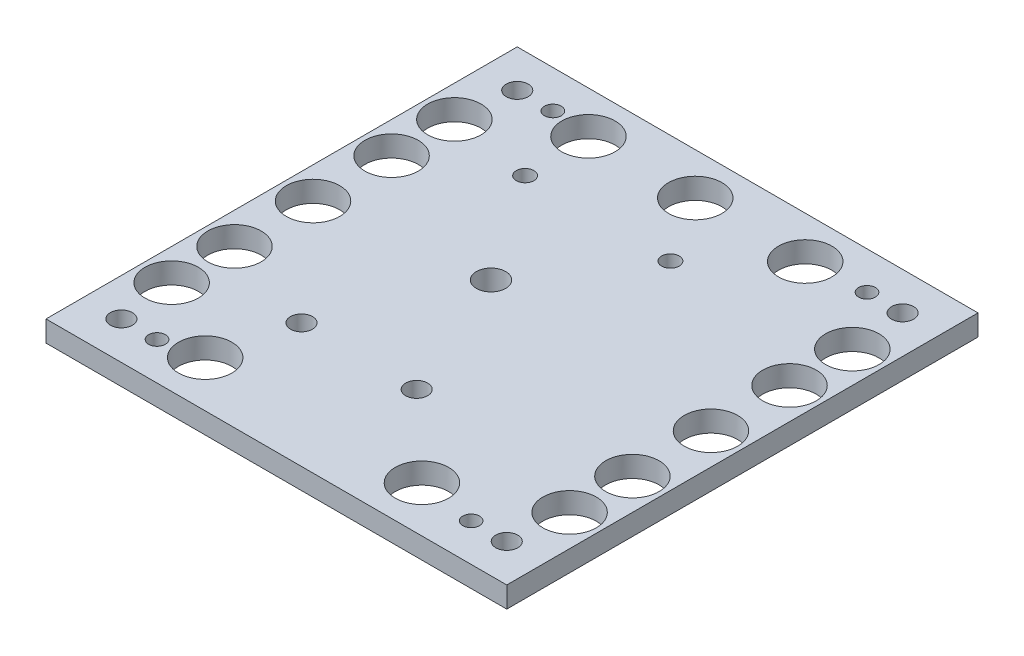
ISO-10303-21;
HEADER;
FILE_DESCRIPTION(('STEP AP214'),'2;1');
FILE_NAME('part.step','',(''),(''),'','','');
FILE_SCHEMA(('AUTOMOTIVE_DESIGN { 1 0 10303 214 1 1 1 1 }'));
ENDSEC;
DATA;
#1=APPLICATION_CONTEXT('core data for automotive mechanical design processes');
#2=APPLICATION_PROTOCOL_DEFINITION('international standard','automotive_design',2000,#1);
#3=PRODUCT_CONTEXT('',#1,'mechanical');
#4=PRODUCT('Part','Part','',(#3));
#5=PRODUCT_RELATED_PRODUCT_CATEGORY('part','',(#4));
#6=PRODUCT_DEFINITION_FORMATION('','',#4);
#7=PRODUCT_DEFINITION_CONTEXT('part definition',#1,'design');
#8=PRODUCT_DEFINITION('design','',#6,#7);
#9=PRODUCT_DEFINITION_SHAPE('','',#8);
#10=(LENGTH_UNIT() NAMED_UNIT(*) SI_UNIT(.MILLI.,.METRE.));
#11=(NAMED_UNIT(*) PLANE_ANGLE_UNIT() SI_UNIT($,.RADIAN.));
#12=(NAMED_UNIT(*) SI_UNIT($,.STERADIAN.) SOLID_ANGLE_UNIT());
#13=UNCERTAINTY_MEASURE_WITH_UNIT(LENGTH_MEASURE(1.E-05),#10,'distance_accuracy_value','');
#14=(GEOMETRIC_REPRESENTATION_CONTEXT(3) GLOBAL_UNCERTAINTY_ASSIGNED_CONTEXT((#13)) GLOBAL_UNIT_ASSIGNED_CONTEXT((#10,
#11,#12)) REPRESENTATION_CONTEXT('',''));
#15=CARTESIAN_POINT('',(0.,0.,0.));
#16=DIRECTION('',(0.,0.,1.));
#17=DIRECTION('',(1.,0.,0.));
#18=AXIS2_PLACEMENT_3D('',#15,#16,#17);
#19=CARTESIAN_POINT('',(110.,10.,112.5));
#20=DIRECTION('',(-1.,0.,0.));
#21=DIRECTION('',(0.,0.,1.));
#22=AXIS2_PLACEMENT_3D('',#19,#20,#21);
#23=PLANE('',#22);
#24=DIRECTION('',(0.,0.,-1.));
#25=VECTOR('',#24,1.);
#26=CARTESIAN_POINT('',(110.,0.,112.5));
#27=LINE('',#26,#25);
#28=CARTESIAN_POINT('',(110.,0.,112.5));
#29=VERTEX_POINT('',#28);
#30=CARTESIAN_POINT('',(110.,0.,-112.5));
#31=VERTEX_POINT('',#30);
#32=EDGE_CURVE('E102',#29,#31,#27,.T.);
#33=ORIENTED_EDGE('',*,*,#32,.T.);
#34=DIRECTION('',(0.,-1.,0.));
#35=VECTOR('',#34,1.);
#36=CARTESIAN_POINT('',(110.,10.,-112.5));
#37=LINE('',#36,#35);
#38=CARTESIAN_POINT('',(110.,10.,-112.5));
#39=VERTEX_POINT('',#38);
#40=EDGE_CURVE('E11',#39,#31,#37,.T.);
#41=ORIENTED_EDGE('',*,*,#40,.F.);
#42=DIRECTION('',(0.,0.,-1.));
#43=VECTOR('',#42,1.);
#44=CARTESIAN_POINT('',(110.,10.,112.5));
#45=LINE('',#44,#43);
#46=CARTESIAN_POINT('',(110.,10.,112.5));
#47=VERTEX_POINT('',#46);
#48=EDGE_CURVE('E90',#47,#39,#45,.T.);
#49=ORIENTED_EDGE('',*,*,#48,.F.);
#50=DIRECTION('',(0.,-1.,0.));
#51=VECTOR('',#50,1.);
#52=CARTESIAN_POINT('',(110.,10.,112.5));
#53=LINE('',#52,#51);
#54=EDGE_CURVE('E98',#47,#29,#53,.T.);
#55=ORIENTED_EDGE('',*,*,#54,.T.);
#56=EDGE_LOOP('',(#33,#41,#49,#55));
#57=FACE_BOUND('',#56,.T.);
#58=ADVANCED_FACE('F39',(#57),#23,.F.);
#59=CARTESIAN_POINT('',(-110.,10.,-112.5));
#60=DIRECTION('',(0.,0.,1.));
#61=DIRECTION('',(1.,0.,0.));
#62=AXIS2_PLACEMENT_3D('',#59,#60,#61);
#63=PLANE('',#62);
#64=DIRECTION('',(-1.,0.,0.));
#65=VECTOR('',#64,1.);
#66=CARTESIAN_POINT('',(-110.,0.,-112.5));
#67=LINE('',#66,#65);
#68=CARTESIAN_POINT('',(-110.,0.,-112.5));
#69=VERTEX_POINT('',#68);
#70=EDGE_CURVE('E94',#31,#69,#67,.T.);
#71=ORIENTED_EDGE('',*,*,#70,.T.);
#72=DIRECTION('',(0.,-1.,0.));
#73=VECTOR('',#72,1.);
#74=CARTESIAN_POINT('',(-110.,10.,-112.5));
#75=LINE('',#74,#73);
#76=CARTESIAN_POINT('',(-110.,10.,-112.5));
#77=VERTEX_POINT('',#76);
#78=EDGE_CURVE('E47',#77,#69,#75,.T.);
#79=ORIENTED_EDGE('',*,*,#78,.F.);
#80=DIRECTION('',(-1.,0.,0.));
#81=VECTOR('',#80,1.);
#82=CARTESIAN_POINT('',(-110.,10.,-112.5));
#83=LINE('',#82,#81);
#84=EDGE_CURVE('E85',#39,#77,#83,.T.);
#85=ORIENTED_EDGE('',*,*,#84,.F.);
#86=ORIENTED_EDGE('',*,*,#40,.T.);
#87=EDGE_LOOP('',(#71,#79,#85,#86));
#88=FACE_BOUND('',#87,.T.);
#89=ADVANCED_FACE('F93',(#88),#63,.F.);
#90=CARTESIAN_POINT('',(-110.,10.,112.5));
#91=DIRECTION('',(1.,0.,0.));
#92=DIRECTION('',(0.,0.,-1.));
#93=AXIS2_PLACEMENT_3D('',#90,#91,#92);
#94=PLANE('',#93);
#95=DIRECTION('',(0.,0.,1.));
#96=VECTOR('',#95,1.);
#97=CARTESIAN_POINT('',(-110.,0.,112.5));
#98=LINE('',#97,#96);
#99=CARTESIAN_POINT('',(-110.,0.,112.5));
#100=VERTEX_POINT('',#99);
#101=EDGE_CURVE('E72',#69,#100,#98,.T.);
#102=ORIENTED_EDGE('',*,*,#101,.T.);
#103=DIRECTION('',(0.,-1.,0.));
#104=VECTOR('',#103,1.);
#105=CARTESIAN_POINT('',(-110.,10.,112.5));
#106=LINE('',#105,#104);
#107=CARTESIAN_POINT('',(-110.,10.,112.5));
#108=VERTEX_POINT('',#107);
#109=EDGE_CURVE('E95',#108,#100,#106,.T.);
#110=ORIENTED_EDGE('',*,*,#109,.F.);
#111=DIRECTION('',(0.,0.,1.));
#112=VECTOR('',#111,1.);
#113=CARTESIAN_POINT('',(-110.,10.,112.5));
#114=LINE('',#113,#112);
#115=EDGE_CURVE('E88',#77,#108,#114,.T.);
#116=ORIENTED_EDGE('',*,*,#115,.F.);
#117=ORIENTED_EDGE('',*,*,#78,.T.);
#118=EDGE_LOOP('',(#102,#110,#116,#117));
#119=FACE_BOUND('',#118,.T.);
#120=ADVANCED_FACE('F96',(#119),#94,.F.);
#121=CARTESIAN_POINT('',(-110.,10.,112.5));
#122=DIRECTION('',(0.,0.,-1.));
#123=DIRECTION('',(-1.,0.,0.));
#124=AXIS2_PLACEMENT_3D('',#121,#122,#123);
#125=PLANE('',#124);
#126=DIRECTION('',(1.,0.,0.));
#127=VECTOR('',#126,1.);
#128=CARTESIAN_POINT('',(-110.,0.,112.5));
#129=LINE('',#128,#127);
#130=EDGE_CURVE('E78',#100,#29,#129,.T.);
#131=ORIENTED_EDGE('',*,*,#130,.T.);
#132=ORIENTED_EDGE('',*,*,#54,.F.);
#133=DIRECTION('',(1.,0.,0.));
#134=VECTOR('',#133,1.);
#135=CARTESIAN_POINT('',(-110.,10.,112.5));
#136=LINE('',#135,#134);
#137=EDGE_CURVE('E55',#108,#47,#136,.T.);
#138=ORIENTED_EDGE('',*,*,#137,.F.);
#139=ORIENTED_EDGE('',*,*,#109,.T.);
#140=EDGE_LOOP('',(#131,#132,#138,#139));
#141=FACE_BOUND('',#140,.T.);
#142=ADVANCED_FACE('F110',(#141),#125,.F.);
#143=CARTESIAN_POINT('',(0.,10.,0.));
#144=DIRECTION('',(0.,-1.,0.));
#145=DIRECTION('',(0.,0.,-1.));
#146=AXIS2_PLACEMENT_3D('',#143,#144,#145);
#147=PLANE('',#146);
#148=CARTESIAN_POINT('',(-94.9999999999998,10.,-37.4999999999994));
#149=DIRECTION('',(0.,1.,0.));
#150=DIRECTION('',(0.,0.,1.));
#151=AXIS2_PLACEMENT_3D('',#148,#149,#150);
#152=CIRCLE('',#151,12.75);
#153=CARTESIAN_POINT('',(-94.9999999999998,10.,-24.7499999999994));
#154=VERTEX_POINT('',#153);
#155=EDGE_CURVE('E224',#154,#154,#152,.T.);
#156=ORIENTED_EDGE('',*,*,#155,.F.);
#157=EDGE_LOOP('',(#156));
#158=FACE_BOUND('',#157,.T.);
#159=CARTESIAN_POINT('',(95.0000000000002,10.,5.38782117032671E-13));
#160=DIRECTION('',(0.,1.,0.));
#161=DIRECTION('',(0.,0.,1.));
#162=AXIS2_PLACEMENT_3D('',#159,#160,#161);
#163=CIRCLE('',#162,12.75);
#164=CARTESIAN_POINT('',(95.0000000000002,10.,12.7500000000005));
#165=VERTEX_POINT('',#164);
#166=EDGE_CURVE('E231',#165,#165,#163,.T.);
#167=ORIENTED_EDGE('',*,*,#166,.F.);
#168=EDGE_LOOP('',(#167));
#169=FACE_BOUND('',#168,.T.);
#170=CARTESIAN_POINT('',(95.0000000000002,10.,37.5000000000005));
#171=DIRECTION('',(0.,1.,0.));
#172=DIRECTION('',(0.,0.,1.));
#173=AXIS2_PLACEMENT_3D('',#170,#171,#172);
#174=CIRCLE('',#173,12.75);
#175=CARTESIAN_POINT('',(95.0000000000002,10.,50.2500000000005));
#176=VERTEX_POINT('',#175);
#177=EDGE_CURVE('E237',#176,#176,#174,.T.);
#178=ORIENTED_EDGE('',*,*,#177,.F.);
#179=EDGE_LOOP('',(#178));
#180=FACE_BOUND('',#179,.T.);
#181=CARTESIAN_POINT('',(95.0000000000002,10.,67.5000000000005));
#182=DIRECTION('',(0.,1.,0.));
#183=DIRECTION('',(0.,0.,1.));
#184=AXIS2_PLACEMENT_3D('',#181,#182,#183);
#185=CIRCLE('',#184,12.75);
#186=CARTESIAN_POINT('',(95.0000000000002,10.,80.2500000000005));
#187=VERTEX_POINT('',#186);
#188=EDGE_CURVE('E243',#187,#187,#185,.T.);
#189=ORIENTED_EDGE('',*,*,#188,.F.);
#190=EDGE_LOOP('',(#189));
#191=FACE_BOUND('',#190,.T.);
#192=CARTESIAN_POINT('',(47.5000000000002,10.,90.5000000000005));
#193=DIRECTION('',(0.,1.,0.));
#194=DIRECTION('',(0.,0.,1.));
#195=AXIS2_PLACEMENT_3D('',#192,#193,#194);
#196=CIRCLE('',#195,12.75);
#197=CARTESIAN_POINT('',(47.5000000000002,10.,103.250000000001));
#198=VERTEX_POINT('',#197);
#199=EDGE_CURVE('E200',#198,#198,#196,.T.);
#200=ORIENTED_EDGE('',*,*,#199,.F.);
#201=EDGE_LOOP('',(#200));
#202=FACE_BOUND('',#201,.T.);
#203=CARTESIAN_POINT('',(-55.9999999999998,10.,90.5000000000005));
#204=DIRECTION('',(0.,1.,0.));
#205=DIRECTION('',(0.,0.,1.));
#206=AXIS2_PLACEMENT_3D('',#203,#204,#205);
#207=CIRCLE('',#206,12.75);
#208=CARTESIAN_POINT('',(-55.9999999999998,10.,103.250000000001));
#209=VERTEX_POINT('',#208);
#210=EDGE_CURVE('E207',#209,#209,#207,.T.);
#211=ORIENTED_EDGE('',*,*,#210,.F.);
#212=EDGE_LOOP('',(#211));
#213=FACE_BOUND('',#212,.T.);
#214=CARTESIAN_POINT('',(-94.9999999999998,10.,67.5000000000005));
#215=DIRECTION('',(0.,1.,0.));
#216=DIRECTION('',(0.,0.,1.));
#217=AXIS2_PLACEMENT_3D('',#214,#215,#216);
#218=CIRCLE('',#217,12.75);
#219=CARTESIAN_POINT('',(-94.9999999999998,10.,80.2500000000005));
#220=VERTEX_POINT('',#219);
#221=EDGE_CURVE('E213',#220,#220,#218,.T.);
#222=ORIENTED_EDGE('',*,*,#221,.F.);
#223=EDGE_LOOP('',(#222));
#224=FACE_BOUND('',#223,.T.);
#225=CARTESIAN_POINT('',(-94.9999999999998,10.,37.5000000000006));
#226=DIRECTION('',(0.,1.,0.));
#227=DIRECTION('',(0.,0.,1.));
#228=AXIS2_PLACEMENT_3D('',#225,#226,#227);
#229=CIRCLE('',#228,12.75);
#230=CARTESIAN_POINT('',(-94.9999999999998,10.,50.2500000000005));
#231=VERTEX_POINT('',#230);
#232=EDGE_CURVE('E219',#231,#231,#229,.T.);
#233=ORIENTED_EDGE('',*,*,#232,.F.);
#234=EDGE_LOOP('',(#233));
#235=FACE_BOUND('',#234,.T.);
#236=CARTESIAN_POINT('',(-55.9999999999998,10.,-92.4999999999994));
#237=DIRECTION('',(0.,1.,0.));
#238=DIRECTION('',(0.,0.,1.));
#239=AXIS2_PLACEMENT_3D('',#236,#237,#238);
#240=CIRCLE('',#239,12.75);
#241=CARTESIAN_POINT('',(-55.9999999999998,10.,-79.7499999999994));
#242=VERTEX_POINT('',#241);
#243=EDGE_CURVE('E272',#242,#242,#240,.T.);
#244=ORIENTED_EDGE('',*,*,#243,.F.);
#245=EDGE_LOOP('',(#244));
#246=FACE_BOUND('',#245,.T.);
#247=CARTESIAN_POINT('',(-4.99999999999981,10.,-92.4999999999994));
#248=DIRECTION('',(0.,1.,0.));
#249=DIRECTION('',(0.,0.,1.));
#250=AXIS2_PLACEMENT_3D('',#247,#248,#249);
#251=CIRCLE('',#250,12.75);
#252=CARTESIAN_POINT('',(-4.99999999999981,10.,-79.7499999999994));
#253=VERTEX_POINT('',#252);
#254=EDGE_CURVE('E278',#253,#253,#251,.T.);
#255=ORIENTED_EDGE('',*,*,#254,.F.);
#256=EDGE_LOOP('',(#255));
#257=FACE_BOUND('',#256,.T.);
#258=CARTESIAN_POINT('',(-94.9999999999998,10.,-67.4999999999994));
#259=DIRECTION('',(0.,1.,0.));
#260=DIRECTION('',(0.,0.,1.));
#261=AXIS2_PLACEMENT_3D('',#258,#259,#260);
#262=CIRCLE('',#261,12.75);
#263=CARTESIAN_POINT('',(-94.9999999999998,10.,-54.7499999999995));
#264=VERTEX_POINT('',#263);
#265=EDGE_CURVE('E255',#264,#264,#262,.T.);
#266=ORIENTED_EDGE('',*,*,#265,.F.);
#267=EDGE_LOOP('',(#266));
#268=FACE_BOUND('',#267,.T.);
#269=CARTESIAN_POINT('',(95.0000000000002,10.,-37.4999999999995));
#270=DIRECTION('',(0.,1.,0.));
#271=DIRECTION('',(0.,0.,1.));
#272=AXIS2_PLACEMENT_3D('',#269,#270,#271);
#273=CIRCLE('',#272,12.75);
#274=CARTESIAN_POINT('',(95.0000000000002,10.,-24.7499999999995));
#275=VERTEX_POINT('',#274);
#276=EDGE_CURVE('E248',#275,#275,#273,.T.);
#277=ORIENTED_EDGE('',*,*,#276,.F.);
#278=EDGE_LOOP('',(#277));
#279=FACE_BOUND('',#278,.T.);
#280=CARTESIAN_POINT('',(95.0000000000002,10.,-67.4999999999995));
#281=DIRECTION('',(0.,1.,0.));
#282=DIRECTION('',(0.,0.,1.));
#283=AXIS2_PLACEMENT_3D('',#280,#281,#282);
#284=CIRCLE('',#283,12.75);
#285=CARTESIAN_POINT('',(95.0000000000002,10.,-54.7499999999995));
#286=VERTEX_POINT('',#285);
#287=EDGE_CURVE('E267',#286,#286,#284,.T.);
#288=ORIENTED_EDGE('',*,*,#287,.F.);
#289=EDGE_LOOP('',(#288));
#290=FACE_BOUND('',#289,.T.);
#291=CARTESIAN_POINT('',(47.5000000000002,10.,-92.4999999999994));
#292=DIRECTION('',(0.,1.,0.));
#293=DIRECTION('',(0.,0.,1.));
#294=AXIS2_PLACEMENT_3D('',#291,#292,#293);
#295=CIRCLE('',#294,12.75);
#296=CARTESIAN_POINT('',(47.5000000000002,10.,-79.7499999999994));
#297=VERTEX_POINT('',#296);
#298=EDGE_CURVE('E260',#297,#297,#295,.T.);
#299=ORIENTED_EDGE('',*,*,#298,.F.);
#300=EDGE_LOOP('',(#299));
#301=FACE_BOUND('',#300,.T.);
#302=CARTESIAN_POINT('',(-94.9999999999998,10.,5.62050406216471E-13));
#303=DIRECTION('',(0.,1.,0.));
#304=DIRECTION('',(0.,0.,1.));
#305=AXIS2_PLACEMENT_3D('',#302,#303,#304);
#306=CIRCLE('',#305,12.75);
#307=CARTESIAN_POINT('',(-94.9999999999998,10.,12.7500000000005));
#308=VERTEX_POINT('',#307);
#309=EDGE_CURVE('E193',#308,#308,#306,.T.);
#310=ORIENTED_EDGE('',*,*,#309,.F.);
#311=EDGE_LOOP('',(#310));
#312=FACE_BOUND('',#311,.T.);
#313=CARTESIAN_POINT('',(15.1299999999992,10.,-60.4999999999988));
#314=DIRECTION('',(0.,1.,0.));
#315=DIRECTION('',(0.,0.,1.));
#316=AXIS2_PLACEMENT_3D('',#313,#314,#315);
#317=CIRCLE('',#316,4.2);
#318=CARTESIAN_POINT('',(15.1299999999992,10.,-56.2999999999988));
#319=VERTEX_POINT('',#318);
#320=EDGE_CURVE('E190',#319,#319,#317,.T.);
#321=ORIENTED_EDGE('',*,*,#320,.F.);
#322=EDGE_LOOP('',(#321));
#323=FACE_BOUND('',#322,.T.);
#324=CARTESIAN_POINT('',(-54.8700000000008,10.,-61.1299999999993));
#325=DIRECTION('',(0.,1.,0.));
#326=DIRECTION('',(0.,0.,1.));
#327=AXIS2_PLACEMENT_3D('',#324,#325,#326);
#328=CIRCLE('',#327,4.2);
#329=CARTESIAN_POINT('',(-54.8700000000008,10.,-56.9299999999993));
#330=VERTEX_POINT('',#329);
#331=EDGE_CURVE('E184',#330,#330,#328,.T.);
#332=ORIENTED_EDGE('',*,*,#331,.F.);
#333=EDGE_LOOP('',(#332));
#334=FACE_BOUND('',#333,.T.);
#335=CARTESIAN_POINT('',(7.63000000000062,10.,53.1400000000011));
#336=DIRECTION('',(0.,1.,0.));
#337=DIRECTION('',(0.,0.,1.));
#338=AXIS2_PLACEMENT_3D('',#335,#336,#337);
#339=CIRCLE('',#338,5.24999999999999);
#340=CARTESIAN_POINT('',(7.63000000000062,10.,58.3900000000011));
#341=VERTEX_POINT('',#340);
#342=EDGE_CURVE('E178',#341,#341,#339,.T.);
#343=ORIENTED_EDGE('',*,*,#342,.F.);
#344=EDGE_LOOP('',(#343));
#345=FACE_BOUND('',#344,.T.);
#346=CARTESIAN_POINT('',(-47.3699999999994,10.,53.1400000000011));
#347=DIRECTION('',(0.,1.,0.));
#348=DIRECTION('',(0.,0.,1.));
#349=AXIS2_PLACEMENT_3D('',#346,#347,#348);
#350=CIRCLE('',#349,5.24999999999999);
#351=CARTESIAN_POINT('',(-47.3699999999994,10.,58.3900000000011));
#352=VERTEX_POINT('',#351);
#353=EDGE_CURVE('E172',#352,#352,#350,.T.);
#354=ORIENTED_EDGE('',*,*,#353,.F.);
#355=EDGE_LOOP('',(#354));
#356=FACE_BOUND('',#355,.T.);
#357=CARTESIAN_POINT('',(92.,10.,94.5));
#358=DIRECTION('',(0.,1.,0.));
#359=DIRECTION('',(0.,0.,1.));
#360=AXIS2_PLACEMENT_3D('',#357,#358,#359);
#361=CIRCLE('',#360,5.25);
#362=CARTESIAN_POINT('',(92.,10.,99.75));
#363=VERTEX_POINT('',#362);
#364=EDGE_CURVE('E166',#363,#363,#361,.T.);
#365=ORIENTED_EDGE('',*,*,#364,.F.);
#366=EDGE_LOOP('',(#365));
#367=FACE_BOUND('',#366,.T.);
#368=CARTESIAN_POINT('',(92.,10.,-94.5));
#369=DIRECTION('',(0.,1.,0.));
#370=DIRECTION('',(0.,0.,1.));
#371=AXIS2_PLACEMENT_3D('',#368,#369,#370);
#372=CIRCLE('',#371,5.25);
#373=CARTESIAN_POINT('',(92.,10.,-89.25));
#374=VERTEX_POINT('',#373);
#375=EDGE_CURVE('E160',#374,#374,#372,.T.);
#376=ORIENTED_EDGE('',*,*,#375,.F.);
#377=EDGE_LOOP('',(#376));
#378=FACE_BOUND('',#377,.T.);
#379=CARTESIAN_POINT('',(-92.,10.,-94.5));
#380=DIRECTION('',(0.,1.,0.));
#381=DIRECTION('',(0.,0.,1.));
#382=AXIS2_PLACEMENT_3D('',#379,#380,#381);
#383=CIRCLE('',#382,5.25);
#384=CARTESIAN_POINT('',(-92.,10.,-89.25));
#385=VERTEX_POINT('',#384);
#386=EDGE_CURVE('E154',#385,#385,#383,.T.);
#387=ORIENTED_EDGE('',*,*,#386,.F.);
#388=EDGE_LOOP('',(#387));
#389=FACE_BOUND('',#388,.T.);
#390=CARTESIAN_POINT('',(-92.,10.,94.5));
#391=DIRECTION('',(0.,1.,0.));
#392=DIRECTION('',(0.,0.,1.));
#393=AXIS2_PLACEMENT_3D('',#390,#391,#392);
#394=CIRCLE('',#393,5.25);
#395=CARTESIAN_POINT('',(-92.,10.,99.75));
#396=VERTEX_POINT('',#395);
#397=EDGE_CURVE('E148',#396,#396,#394,.T.);
#398=ORIENTED_EDGE('',*,*,#397,.F.);
#399=EDGE_LOOP('',(#398));
#400=FACE_BOUND('',#399,.T.);
#401=CARTESIAN_POINT('',(75.,10.,94.5));
#402=DIRECTION('',(0.,1.,0.));
#403=DIRECTION('',(0.,0.,1.));
#404=AXIS2_PLACEMENT_3D('',#401,#402,#403);
#405=CIRCLE('',#404,4.);
#406=CARTESIAN_POINT('',(75.,10.,98.5));
#407=VERTEX_POINT('',#406);
#408=EDGE_CURVE('E142',#407,#407,#405,.T.);
#409=ORIENTED_EDGE('',*,*,#408,.F.);
#410=EDGE_LOOP('',(#409));
#411=FACE_BOUND('',#410,.T.);
#412=CARTESIAN_POINT('',(-75.,10.,94.5));
#413=DIRECTION('',(0.,1.,0.));
#414=DIRECTION('',(0.,0.,1.));
#415=AXIS2_PLACEMENT_3D('',#412,#413,#414);
#416=CIRCLE('',#415,4.);
#417=CARTESIAN_POINT('',(-75.,10.,98.5));
#418=VERTEX_POINT('',#417);
#419=EDGE_CURVE('E136',#418,#418,#416,.T.);
#420=ORIENTED_EDGE('',*,*,#419,.F.);
#421=EDGE_LOOP('',(#420));
#422=FACE_BOUND('',#421,.T.);
#423=CARTESIAN_POINT('',(75.,10.,-94.5));
#424=DIRECTION('',(0.,1.,0.));
#425=DIRECTION('',(0.,0.,1.));
#426=AXIS2_PLACEMENT_3D('',#423,#424,#425);
#427=CIRCLE('',#426,4.);
#428=CARTESIAN_POINT('',(75.,10.,-90.5));
#429=VERTEX_POINT('',#428);
#430=EDGE_CURVE('E130',#429,#429,#427,.T.);
#431=ORIENTED_EDGE('',*,*,#430,.F.);
#432=EDGE_LOOP('',(#431));
#433=FACE_BOUND('',#432,.T.);
#434=CARTESIAN_POINT('',(-75.,10.,-94.5));
#435=DIRECTION('',(0.,1.,0.));
#436=DIRECTION('',(0.,0.,1.));
#437=AXIS2_PLACEMENT_3D('',#434,#435,#436);
#438=CIRCLE('',#437,4.);
#439=CARTESIAN_POINT('',(-75.,10.,-90.5));
#440=VERTEX_POINT('',#439);
#441=EDGE_CURVE('E124',#440,#440,#438,.T.);
#442=ORIENTED_EDGE('',*,*,#441,.F.);
#443=EDGE_LOOP('',(#442));
#444=FACE_BOUND('',#443,.T.);
#445=CARTESIAN_POINT('',(-19.8699999999994,10.,-9.85999999999988));
#446=DIRECTION('',(0.,-1.,0.));
#447=DIRECTION('',(0.,0.,-1.));
#448=AXIS2_PLACEMENT_3D('',#445,#446,#447);
#449=CIRCLE('',#448,7.);
#450=CARTESIAN_POINT('',(-19.8699999999994,10.,-16.8599999999999));
#451=VERTEX_POINT('',#450);
#452=EDGE_CURVE('E105',#451,#451,#449,.F.);
#453=ORIENTED_EDGE('',*,*,#452,.F.);
#454=EDGE_LOOP('',(#453));
#455=FACE_BOUND('',#454,.T.);
#456=ORIENTED_EDGE('',*,*,#48,.T.);
#457=ORIENTED_EDGE('',*,*,#84,.T.);
#458=ORIENTED_EDGE('',*,*,#115,.T.);
#459=ORIENTED_EDGE('',*,*,#137,.T.);
#460=EDGE_LOOP('',(#456,#457,#458,#459));
#461=FACE_BOUND('',#460,.T.);
#462=ADVANCED_FACE('F86',(#158,#169,#180,#191,#202,#213,#224,#235,#246,#257,#268,#279,#290,#301,
#312,#323,#334,#345,#356,#367,#378,#389,#400,#411,#422,#433,#444,#455,#461),#147,.F.);
#463=CARTESIAN_POINT('',(0.,0.,0.));
#464=DIRECTION('',(0.,-1.,0.));
#465=DIRECTION('',(0.,0.,-1.));
#466=AXIS2_PLACEMENT_3D('',#463,#464,#465);
#467=PLANE('',#466);
#468=CARTESIAN_POINT('',(-94.9999999999998,0.,-37.4999999999994));
#469=DIRECTION('',(0.,-1.,0.));
#470=DIRECTION('',(0.,0.,-1.));
#471=AXIS2_PLACEMENT_3D('',#468,#469,#470);
#472=CIRCLE('',#471,12.75);
#473=CARTESIAN_POINT('',(-94.9999999999998,0.,-50.2499999999994));
#474=VERTEX_POINT('',#473);
#475=EDGE_CURVE('E227',#474,#474,#472,.F.);
#476=ORIENTED_EDGE('',*,*,#475,.T.);
#477=EDGE_LOOP('',(#476));
#478=FACE_BOUND('',#477,.T.);
#479=CARTESIAN_POINT('',(95.0000000000002,0.,5.38782117032671E-13));
#480=DIRECTION('',(0.,-1.,0.));
#481=DIRECTION('',(0.,0.,-1.));
#482=AXIS2_PLACEMENT_3D('',#479,#480,#481);
#483=CIRCLE('',#482,12.75);
#484=CARTESIAN_POINT('',(95.0000000000002,0.,-12.7499999999995));
#485=VERTEX_POINT('',#484);
#486=EDGE_CURVE('E234',#485,#485,#483,.F.);
#487=ORIENTED_EDGE('',*,*,#486,.T.);
#488=EDGE_LOOP('',(#487));
#489=FACE_BOUND('',#488,.T.);
#490=CARTESIAN_POINT('',(95.0000000000002,0.,37.5000000000005));
#491=DIRECTION('',(0.,-1.,0.));
#492=DIRECTION('',(0.,0.,-1.));
#493=AXIS2_PLACEMENT_3D('',#490,#491,#492);
#494=CIRCLE('',#493,12.75);
#495=CARTESIAN_POINT('',(95.0000000000002,0.,24.7500000000005));
#496=VERTEX_POINT('',#495);
#497=EDGE_CURVE('E240',#496,#496,#494,.F.);
#498=ORIENTED_EDGE('',*,*,#497,.T.);
#499=EDGE_LOOP('',(#498));
#500=FACE_BOUND('',#499,.T.);
#501=CARTESIAN_POINT('',(95.0000000000002,0.,67.5000000000005));
#502=DIRECTION('',(0.,-1.,0.));
#503=DIRECTION('',(0.,0.,-1.));
#504=AXIS2_PLACEMENT_3D('',#501,#502,#503);
#505=CIRCLE('',#504,12.75);
#506=CARTESIAN_POINT('',(95.0000000000002,0.,54.7500000000005));
#507=VERTEX_POINT('',#506);
#508=EDGE_CURVE('E204',#507,#507,#505,.F.);
#509=ORIENTED_EDGE('',*,*,#508,.T.);
#510=EDGE_LOOP('',(#509));
#511=FACE_BOUND('',#510,.T.);
#512=CARTESIAN_POINT('',(47.5000000000002,0.,90.5000000000005));
#513=DIRECTION('',(0.,-1.,0.));
#514=DIRECTION('',(0.,0.,-1.));
#515=AXIS2_PLACEMENT_3D('',#512,#513,#514);
#516=CIRCLE('',#515,12.75);
#517=CARTESIAN_POINT('',(47.5000000000002,0.,77.7500000000005));
#518=VERTEX_POINT('',#517);
#519=EDGE_CURVE('E203',#518,#518,#516,.F.);
#520=ORIENTED_EDGE('',*,*,#519,.T.);
#521=EDGE_LOOP('',(#520));
#522=FACE_BOUND('',#521,.T.);
#523=CARTESIAN_POINT('',(-55.9999999999998,0.,90.5000000000005));
#524=DIRECTION('',(0.,-1.,0.));
#525=DIRECTION('',(0.,0.,-1.));
#526=AXIS2_PLACEMENT_3D('',#523,#524,#525);
#527=CIRCLE('',#526,12.75);
#528=CARTESIAN_POINT('',(-55.9999999999998,0.,77.7500000000005));
#529=VERTEX_POINT('',#528);
#530=EDGE_CURVE('E210',#529,#529,#527,.F.);
#531=ORIENTED_EDGE('',*,*,#530,.T.);
#532=EDGE_LOOP('',(#531));
#533=FACE_BOUND('',#532,.T.);
#534=CARTESIAN_POINT('',(-94.9999999999998,0.,67.5000000000005));
#535=DIRECTION('',(0.,-1.,0.));
#536=DIRECTION('',(0.,0.,-1.));
#537=AXIS2_PLACEMENT_3D('',#534,#535,#536);
#538=CIRCLE('',#537,12.75);
#539=CARTESIAN_POINT('',(-94.9999999999998,0.,54.7500000000006));
#540=VERTEX_POINT('',#539);
#541=EDGE_CURVE('E216',#540,#540,#538,.F.);
#542=ORIENTED_EDGE('',*,*,#541,.T.);
#543=EDGE_LOOP('',(#542));
#544=FACE_BOUND('',#543,.T.);
#545=CARTESIAN_POINT('',(-94.9999999999998,0.,37.5000000000006));
#546=DIRECTION('',(0.,-1.,0.));
#547=DIRECTION('',(0.,0.,-1.));
#548=AXIS2_PLACEMENT_3D('',#545,#546,#547);
#549=CIRCLE('',#548,12.75);
#550=CARTESIAN_POINT('',(-94.9999999999998,0.,24.7500000000006));
#551=VERTEX_POINT('',#550);
#552=EDGE_CURVE('E197',#551,#551,#549,.F.);
#553=ORIENTED_EDGE('',*,*,#552,.T.);
#554=EDGE_LOOP('',(#553));
#555=FACE_BOUND('',#554,.T.);
#556=CARTESIAN_POINT('',(-55.9999999999998,0.,-92.4999999999994));
#557=DIRECTION('',(0.,-1.,0.));
#558=DIRECTION('',(0.,0.,-1.));
#559=AXIS2_PLACEMENT_3D('',#556,#557,#558);
#560=CIRCLE('',#559,12.75);
#561=CARTESIAN_POINT('',(-55.9999999999998,0.,-105.249999999999));
#562=VERTEX_POINT('',#561);
#563=EDGE_CURVE('E275',#562,#562,#560,.F.);
#564=ORIENTED_EDGE('',*,*,#563,.T.);
#565=EDGE_LOOP('',(#564));
#566=FACE_BOUND('',#565,.T.);
#567=CARTESIAN_POINT('',(-4.99999999999981,0.,-92.4999999999994));
#568=DIRECTION('',(0.,-1.,0.));
#569=DIRECTION('',(0.,0.,-1.));
#570=AXIS2_PLACEMENT_3D('',#567,#568,#569);
#571=CIRCLE('',#570,12.75);
#572=CARTESIAN_POINT('',(-4.99999999999981,0.,-105.249999999999));
#573=VERTEX_POINT('',#572);
#574=EDGE_CURVE('E264',#573,#573,#571,.F.);
#575=ORIENTED_EDGE('',*,*,#574,.T.);
#576=EDGE_LOOP('',(#575));
#577=FACE_BOUND('',#576,.T.);
#578=CARTESIAN_POINT('',(-94.9999999999998,0.,-67.4999999999994));
#579=DIRECTION('',(0.,-1.,0.));
#580=DIRECTION('',(0.,0.,-1.));
#581=AXIS2_PLACEMENT_3D('',#578,#579,#580);
#582=CIRCLE('',#581,12.75);
#583=CARTESIAN_POINT('',(-94.9999999999998,0.,-80.2499999999994));
#584=VERTEX_POINT('',#583);
#585=EDGE_CURVE('E228',#584,#584,#582,.F.);
#586=ORIENTED_EDGE('',*,*,#585,.T.);
#587=EDGE_LOOP('',(#586));
#588=FACE_BOUND('',#587,.T.);
#589=CARTESIAN_POINT('',(95.0000000000002,0.,-37.4999999999995));
#590=DIRECTION('',(0.,-1.,0.));
#591=DIRECTION('',(0.,0.,-1.));
#592=AXIS2_PLACEMENT_3D('',#589,#590,#591);
#593=CIRCLE('',#592,12.75);
#594=CARTESIAN_POINT('',(95.0000000000002,0.,-50.2499999999994));
#595=VERTEX_POINT('',#594);
#596=EDGE_CURVE('E251',#595,#595,#593,.F.);
#597=ORIENTED_EDGE('',*,*,#596,.T.);
#598=EDGE_LOOP('',(#597));
#599=FACE_BOUND('',#598,.T.);
#600=CARTESIAN_POINT('',(95.0000000000002,0.,-67.4999999999995));
#601=DIRECTION('',(0.,-1.,0.));
#602=DIRECTION('',(0.,0.,-1.));
#603=AXIS2_PLACEMENT_3D('',#600,#601,#602);
#604=CIRCLE('',#603,12.75);
#605=CARTESIAN_POINT('',(95.0000000000002,0.,-80.2499999999995));
#606=VERTEX_POINT('',#605);
#607=EDGE_CURVE('E252',#606,#606,#604,.F.);
#608=ORIENTED_EDGE('',*,*,#607,.T.);
#609=EDGE_LOOP('',(#608));
#610=FACE_BOUND('',#609,.T.);
#611=CARTESIAN_POINT('',(47.5000000000002,0.,-92.4999999999994));
#612=DIRECTION('',(0.,-1.,0.));
#613=DIRECTION('',(0.,0.,-1.));
#614=AXIS2_PLACEMENT_3D('',#611,#612,#613);
#615=CIRCLE('',#614,12.75);
#616=CARTESIAN_POINT('',(47.5000000000002,0.,-105.249999999999));
#617=VERTEX_POINT('',#616);
#618=EDGE_CURVE('E263',#617,#617,#615,.F.);
#619=ORIENTED_EDGE('',*,*,#618,.T.);
#620=EDGE_LOOP('',(#619));
#621=FACE_BOUND('',#620,.T.);
#622=CARTESIAN_POINT('',(-94.9999999999998,0.,5.62050406216471E-13));
#623=DIRECTION('',(0.,-1.,0.));
#624=DIRECTION('',(0.,0.,-1.));
#625=AXIS2_PLACEMENT_3D('',#622,#623,#624);
#626=CIRCLE('',#625,12.75);
#627=CARTESIAN_POINT('',(-94.9999999999998,0.,-12.7499999999994));
#628=VERTEX_POINT('',#627);
#629=EDGE_CURVE('E194',#628,#628,#626,.F.);
#630=ORIENTED_EDGE('',*,*,#629,.T.);
#631=EDGE_LOOP('',(#630));
#632=FACE_BOUND('',#631,.T.);
#633=CARTESIAN_POINT('',(15.1299999999992,0.,-60.4999999999988));
#634=DIRECTION('',(0.,1.,0.));
#635=DIRECTION('',(0.,0.,1.));
#636=AXIS2_PLACEMENT_3D('',#633,#634,#635);
#637=CIRCLE('',#636,4.2);
#638=CARTESIAN_POINT('',(15.1299999999992,0.,-56.2999999999988));
#639=VERTEX_POINT('',#638);
#640=EDGE_CURVE('E187',#639,#639,#637,.T.);
#641=ORIENTED_EDGE('',*,*,#640,.T.);
#642=EDGE_LOOP('',(#641));
#643=FACE_BOUND('',#642,.T.);
#644=CARTESIAN_POINT('',(-54.8700000000008,0.,-61.1299999999993));
#645=DIRECTION('',(0.,1.,0.));
#646=DIRECTION('',(0.,0.,1.));
#647=AXIS2_PLACEMENT_3D('',#644,#645,#646);
#648=CIRCLE('',#647,4.2);
#649=CARTESIAN_POINT('',(-54.8700000000008,0.,-56.9299999999993));
#650=VERTEX_POINT('',#649);
#651=EDGE_CURVE('E181',#650,#650,#648,.T.);
#652=ORIENTED_EDGE('',*,*,#651,.T.);
#653=EDGE_LOOP('',(#652));
#654=FACE_BOUND('',#653,.T.);
#655=CARTESIAN_POINT('',(7.63000000000062,0.,53.1400000000011));
#656=DIRECTION('',(0.,1.,0.));
#657=DIRECTION('',(0.,0.,1.));
#658=AXIS2_PLACEMENT_3D('',#655,#656,#657);
#659=CIRCLE('',#658,5.25);
#660=CARTESIAN_POINT('',(7.63000000000062,0.,58.3900000000011));
#661=VERTEX_POINT('',#660);
#662=EDGE_CURVE('E175',#661,#661,#659,.T.);
#663=ORIENTED_EDGE('',*,*,#662,.T.);
#664=EDGE_LOOP('',(#663));
#665=FACE_BOUND('',#664,.T.);
#666=CARTESIAN_POINT('',(-47.3699999999994,0.,53.1400000000011));
#667=DIRECTION('',(0.,1.,0.));
#668=DIRECTION('',(0.,0.,1.));
#669=AXIS2_PLACEMENT_3D('',#666,#667,#668);
#670=CIRCLE('',#669,5.25);
#671=CARTESIAN_POINT('',(-47.3699999999994,0.,58.3900000000011));
#672=VERTEX_POINT('',#671);
#673=EDGE_CURVE('E169',#672,#672,#670,.T.);
#674=ORIENTED_EDGE('',*,*,#673,.T.);
#675=EDGE_LOOP('',(#674));
#676=FACE_BOUND('',#675,.T.);
#677=CARTESIAN_POINT('',(92.,0.,94.5));
#678=DIRECTION('',(0.,1.,0.));
#679=DIRECTION('',(0.,0.,1.));
#680=AXIS2_PLACEMENT_3D('',#677,#678,#679);
#681=CIRCLE('',#680,5.24999999999999);
#682=CARTESIAN_POINT('',(92.,0.,99.75));
#683=VERTEX_POINT('',#682);
#684=EDGE_CURVE('E163',#683,#683,#681,.T.);
#685=ORIENTED_EDGE('',*,*,#684,.T.);
#686=EDGE_LOOP('',(#685));
#687=FACE_BOUND('',#686,.T.);
#688=CARTESIAN_POINT('',(92.,0.,-94.5));
#689=DIRECTION('',(0.,1.,0.));
#690=DIRECTION('',(0.,0.,1.));
#691=AXIS2_PLACEMENT_3D('',#688,#689,#690);
#692=CIRCLE('',#691,5.25);
#693=CARTESIAN_POINT('',(92.,0.,-89.25));
#694=VERTEX_POINT('',#693);
#695=EDGE_CURVE('E157',#694,#694,#692,.T.);
#696=ORIENTED_EDGE('',*,*,#695,.T.);
#697=EDGE_LOOP('',(#696));
#698=FACE_BOUND('',#697,.T.);
#699=CARTESIAN_POINT('',(-92.,0.,-94.5));
#700=DIRECTION('',(0.,1.,0.));
#701=DIRECTION('',(0.,0.,1.));
#702=AXIS2_PLACEMENT_3D('',#699,#700,#701);
#703=CIRCLE('',#702,5.25);
#704=CARTESIAN_POINT('',(-92.,0.,-89.25));
#705=VERTEX_POINT('',#704);
#706=EDGE_CURVE('E151',#705,#705,#703,.T.);
#707=ORIENTED_EDGE('',*,*,#706,.T.);
#708=EDGE_LOOP('',(#707));
#709=FACE_BOUND('',#708,.T.);
#710=CARTESIAN_POINT('',(-92.,0.,94.5));
#711=DIRECTION('',(0.,1.,0.));
#712=DIRECTION('',(0.,0.,1.));
#713=AXIS2_PLACEMENT_3D('',#710,#711,#712);
#714=CIRCLE('',#713,5.25);
#715=CARTESIAN_POINT('',(-92.,0.,99.75));
#716=VERTEX_POINT('',#715);
#717=EDGE_CURVE('E145',#716,#716,#714,.T.);
#718=ORIENTED_EDGE('',*,*,#717,.T.);
#719=EDGE_LOOP('',(#718));
#720=FACE_BOUND('',#719,.T.);
#721=CARTESIAN_POINT('',(75.,0.,94.5));
#722=DIRECTION('',(0.,1.,0.));
#723=DIRECTION('',(0.,0.,1.));
#724=AXIS2_PLACEMENT_3D('',#721,#722,#723);
#725=CIRCLE('',#724,4.);
#726=CARTESIAN_POINT('',(75.,0.,98.5));
#727=VERTEX_POINT('',#726);
#728=EDGE_CURVE('E139',#727,#727,#725,.T.);
#729=ORIENTED_EDGE('',*,*,#728,.T.);
#730=EDGE_LOOP('',(#729));
#731=FACE_BOUND('',#730,.T.);
#732=CARTESIAN_POINT('',(-75.,0.,94.5));
#733=DIRECTION('',(0.,1.,0.));
#734=DIRECTION('',(0.,0.,1.));
#735=AXIS2_PLACEMENT_3D('',#732,#733,#734);
#736=CIRCLE('',#735,4.);
#737=CARTESIAN_POINT('',(-75.,0.,98.5));
#738=VERTEX_POINT('',#737);
#739=EDGE_CURVE('E133',#738,#738,#736,.T.);
#740=ORIENTED_EDGE('',*,*,#739,.T.);
#741=EDGE_LOOP('',(#740));
#742=FACE_BOUND('',#741,.T.);
#743=CARTESIAN_POINT('',(75.,0.,-94.5));
#744=DIRECTION('',(0.,1.,0.));
#745=DIRECTION('',(0.,0.,1.));
#746=AXIS2_PLACEMENT_3D('',#743,#744,#745);
#747=CIRCLE('',#746,4.);
#748=CARTESIAN_POINT('',(75.,0.,-90.5));
#749=VERTEX_POINT('',#748);
#750=EDGE_CURVE('E127',#749,#749,#747,.T.);
#751=ORIENTED_EDGE('',*,*,#750,.T.);
#752=EDGE_LOOP('',(#751));
#753=FACE_BOUND('',#752,.T.);
#754=CARTESIAN_POINT('',(-75.,0.,-94.5));
#755=DIRECTION('',(0.,1.,0.));
#756=DIRECTION('',(0.,0.,1.));
#757=AXIS2_PLACEMENT_3D('',#754,#755,#756);
#758=CIRCLE('',#757,4.);
#759=CARTESIAN_POINT('',(-75.,0.,-90.5));
#760=VERTEX_POINT('',#759);
#761=EDGE_CURVE('E121',#760,#760,#758,.T.);
#762=ORIENTED_EDGE('',*,*,#761,.T.);
#763=EDGE_LOOP('',(#762));
#764=FACE_BOUND('',#763,.T.);
#765=CARTESIAN_POINT('',(-19.8699999999994,0.,-9.85999999999988));
#766=DIRECTION('',(0.,-1.,0.));
#767=DIRECTION('',(0.,0.,-1.));
#768=AXIS2_PLACEMENT_3D('',#765,#766,#767);
#769=CIRCLE('',#768,7.);
#770=CARTESIAN_POINT('',(-19.8699999999994,0.,-16.8599999999999));
#771=VERTEX_POINT('',#770);
#772=EDGE_CURVE('E118',#771,#771,#769,.T.);
#773=ORIENTED_EDGE('',*,*,#772,.F.);
#774=EDGE_LOOP('',(#773));
#775=FACE_BOUND('',#774,.T.);
#776=ORIENTED_EDGE('',*,*,#32,.F.);
#777=ORIENTED_EDGE('',*,*,#130,.F.);
#778=ORIENTED_EDGE('',*,*,#101,.F.);
#779=ORIENTED_EDGE('',*,*,#70,.F.);
#780=EDGE_LOOP('',(#776,#777,#778,#779));
#781=FACE_BOUND('',#780,.T.);
#782=ADVANCED_FACE('F113',(#478,#489,#500,#511,#522,#533,#544,#555,#566,#577,#588,#599,#610,
#621,#632,#643,#654,#665,#676,#687,#698,#709,#720,#731,#742,#753,#764,#775,#781),#467,.T.);
#783=CARTESIAN_POINT('',(-19.8699999999994,10.001,-9.85999999999988));
#784=DIRECTION('',(0.,-1.,0.));
#785=DIRECTION('',(0.,0.,-1.));
#786=AXIS2_PLACEMENT_3D('',#783,#784,#785);
#787=CYLINDRICAL_SURFACE('',#786,7.);
#788=ORIENTED_EDGE('',*,*,#772,.T.);
#789=EDGE_LOOP('',(#788));
#790=FACE_BOUND('',#789,.T.);
#791=ORIENTED_EDGE('',*,*,#452,.T.);
#792=EDGE_LOOP('',(#791));
#793=FACE_BOUND('',#792,.T.);
#794=ADVANCED_FACE('F334',(#790,#793),#787,.F.);
#795=CARTESIAN_POINT('',(-75.,10.,-94.5));
#796=DIRECTION('',(0.,1.,0.));
#797=DIRECTION('',(0.,0.,1.));
#798=AXIS2_PLACEMENT_3D('',#795,#796,#797);
#799=CYLINDRICAL_SURFACE('',#798,4.);
#800=ORIENTED_EDGE('',*,*,#761,.F.);
#801=EDGE_LOOP('',(#800));
#802=FACE_BOUND('',#801,.T.);
#803=ORIENTED_EDGE('',*,*,#441,.T.);
#804=EDGE_LOOP('',(#803));
#805=FACE_BOUND('',#804,.T.);
#806=ADVANCED_FACE('F336',(#802,#805),#799,.F.);
#807=CARTESIAN_POINT('',(75.,10.,-94.5));
#808=DIRECTION('',(0.,1.,0.));
#809=DIRECTION('',(0.,0.,1.));
#810=AXIS2_PLACEMENT_3D('',#807,#808,#809);
#811=CYLINDRICAL_SURFACE('',#810,4.);
#812=ORIENTED_EDGE('',*,*,#750,.F.);
#813=EDGE_LOOP('',(#812));
#814=FACE_BOUND('',#813,.T.);
#815=ORIENTED_EDGE('',*,*,#430,.T.);
#816=EDGE_LOOP('',(#815));
#817=FACE_BOUND('',#816,.T.);
#818=ADVANCED_FACE('F343',(#814,#817),#811,.F.);
#819=CARTESIAN_POINT('',(-75.,10.,94.5));
#820=DIRECTION('',(0.,1.,0.));
#821=DIRECTION('',(0.,0.,1.));
#822=AXIS2_PLACEMENT_3D('',#819,#820,#821);
#823=CYLINDRICAL_SURFACE('',#822,4.);
#824=ORIENTED_EDGE('',*,*,#739,.F.);
#825=EDGE_LOOP('',(#824));
#826=FACE_BOUND('',#825,.T.);
#827=ORIENTED_EDGE('',*,*,#419,.T.);
#828=EDGE_LOOP('',(#827));
#829=FACE_BOUND('',#828,.T.);
#830=ADVANCED_FACE('F402',(#826,#829),#823,.F.);
#831=CARTESIAN_POINT('',(75.,10.,94.5));
#832=DIRECTION('',(0.,1.,0.));
#833=DIRECTION('',(0.,0.,1.));
#834=AXIS2_PLACEMENT_3D('',#831,#832,#833);
#835=CYLINDRICAL_SURFACE('',#834,4.);
#836=ORIENTED_EDGE('',*,*,#728,.F.);
#837=EDGE_LOOP('',(#836));
#838=FACE_BOUND('',#837,.T.);
#839=ORIENTED_EDGE('',*,*,#408,.T.);
#840=EDGE_LOOP('',(#839));
#841=FACE_BOUND('',#840,.T.);
#842=ADVANCED_FACE('F411',(#838,#841),#835,.F.);
#843=CARTESIAN_POINT('',(-92.,10.,94.5));
#844=DIRECTION('',(0.,1.,0.));
#845=DIRECTION('',(0.,0.,1.));
#846=AXIS2_PLACEMENT_3D('',#843,#844,#845);
#847=CYLINDRICAL_SURFACE('',#846,5.25);
#848=ORIENTED_EDGE('',*,*,#717,.F.);
#849=EDGE_LOOP('',(#848));
#850=FACE_BOUND('',#849,.T.);
#851=ORIENTED_EDGE('',*,*,#397,.T.);
#852=EDGE_LOOP('',(#851));
#853=FACE_BOUND('',#852,.T.);
#854=ADVANCED_FACE('F420',(#850,#853),#847,.F.);
#855=CARTESIAN_POINT('',(-92.,10.,-94.5));
#856=DIRECTION('',(0.,1.,0.));
#857=DIRECTION('',(0.,0.,1.));
#858=AXIS2_PLACEMENT_3D('',#855,#856,#857);
#859=CYLINDRICAL_SURFACE('',#858,5.25);
#860=ORIENTED_EDGE('',*,*,#706,.F.);
#861=EDGE_LOOP('',(#860));
#862=FACE_BOUND('',#861,.T.);
#863=ORIENTED_EDGE('',*,*,#386,.T.);
#864=EDGE_LOOP('',(#863));
#865=FACE_BOUND('',#864,.T.);
#866=ADVANCED_FACE('F429',(#862,#865),#859,.F.);
#867=CARTESIAN_POINT('',(92.,10.,-94.5));
#868=DIRECTION('',(0.,1.,0.));
#869=DIRECTION('',(0.,0.,1.));
#870=AXIS2_PLACEMENT_3D('',#867,#868,#869);
#871=CYLINDRICAL_SURFACE('',#870,5.25);
#872=ORIENTED_EDGE('',*,*,#695,.F.);
#873=EDGE_LOOP('',(#872));
#874=FACE_BOUND('',#873,.T.);
#875=ORIENTED_EDGE('',*,*,#375,.T.);
#876=EDGE_LOOP('',(#875));
#877=FACE_BOUND('',#876,.T.);
#878=ADVANCED_FACE('F438',(#874,#877),#871,.F.);
#879=CARTESIAN_POINT('',(92.,10.,94.5));
#880=DIRECTION('',(0.,1.,0.));
#881=DIRECTION('',(0.,0.,1.));
#882=AXIS2_PLACEMENT_3D('',#879,#880,#881);
#883=CYLINDRICAL_SURFACE('',#882,5.25);
#884=ORIENTED_EDGE('',*,*,#684,.F.);
#885=EDGE_LOOP('',(#884));
#886=FACE_BOUND('',#885,.T.);
#887=ORIENTED_EDGE('',*,*,#364,.T.);
#888=EDGE_LOOP('',(#887));
#889=FACE_BOUND('',#888,.T.);
#890=ADVANCED_FACE('F447',(#886,#889),#883,.F.);
#891=CARTESIAN_POINT('',(-47.3699999999994,10.,53.1400000000011));
#892=DIRECTION('',(0.,1.,0.));
#893=DIRECTION('',(0.,0.,1.));
#894=AXIS2_PLACEMENT_3D('',#891,#892,#893);
#895=CYLINDRICAL_SURFACE('',#894,5.24999999999999);
#896=ORIENTED_EDGE('',*,*,#673,.F.);
#897=EDGE_LOOP('',(#896));
#898=FACE_BOUND('',#897,.T.);
#899=ORIENTED_EDGE('',*,*,#353,.T.);
#900=EDGE_LOOP('',(#899));
#901=FACE_BOUND('',#900,.T.);
#902=ADVANCED_FACE('F456',(#898,#901),#895,.F.);
#903=CARTESIAN_POINT('',(7.63000000000062,10.,53.1400000000011));
#904=DIRECTION('',(0.,1.,0.));
#905=DIRECTION('',(0.,0.,1.));
#906=AXIS2_PLACEMENT_3D('',#903,#904,#905);
#907=CYLINDRICAL_SURFACE('',#906,5.24999999999999);
#908=ORIENTED_EDGE('',*,*,#662,.F.);
#909=EDGE_LOOP('',(#908));
#910=FACE_BOUND('',#909,.T.);
#911=ORIENTED_EDGE('',*,*,#342,.T.);
#912=EDGE_LOOP('',(#911));
#913=FACE_BOUND('',#912,.T.);
#914=ADVANCED_FACE('F465',(#910,#913),#907,.F.);
#915=CARTESIAN_POINT('',(-54.8700000000008,10.,-61.1299999999993));
#916=DIRECTION('',(0.,1.,0.));
#917=DIRECTION('',(0.,0.,1.));
#918=AXIS2_PLACEMENT_3D('',#915,#916,#917);
#919=CYLINDRICAL_SURFACE('',#918,4.2);
#920=ORIENTED_EDGE('',*,*,#651,.F.);
#921=EDGE_LOOP('',(#920));
#922=FACE_BOUND('',#921,.T.);
#923=ORIENTED_EDGE('',*,*,#331,.T.);
#924=EDGE_LOOP('',(#923));
#925=FACE_BOUND('',#924,.T.);
#926=ADVANCED_FACE('F474',(#922,#925),#919,.F.);
#927=CARTESIAN_POINT('',(15.1299999999992,10.,-60.4999999999988));
#928=DIRECTION('',(0.,1.,0.));
#929=DIRECTION('',(0.,0.,1.));
#930=AXIS2_PLACEMENT_3D('',#927,#928,#929);
#931=CYLINDRICAL_SURFACE('',#930,4.2);
#932=ORIENTED_EDGE('',*,*,#640,.F.);
#933=EDGE_LOOP('',(#932));
#934=FACE_BOUND('',#933,.T.);
#935=ORIENTED_EDGE('',*,*,#320,.T.);
#936=EDGE_LOOP('',(#935));
#937=FACE_BOUND('',#936,.T.);
#938=ADVANCED_FACE('F483',(#934,#937),#931,.F.);
#939=CARTESIAN_POINT('',(-94.9999999999998,-0.000999999999999265,5.62050406216471E-13));
#940=DIRECTION('',(0.,1.,0.));
#941=DIRECTION('',(0.,0.,1.));
#942=AXIS2_PLACEMENT_3D('',#939,#940,#941);
#943=CYLINDRICAL_SURFACE('',#942,12.75);
#944=ORIENTED_EDGE('',*,*,#629,.F.);
#945=EDGE_LOOP('',(#944));
#946=FACE_BOUND('',#945,.T.);
#947=ORIENTED_EDGE('',*,*,#309,.T.);
#948=EDGE_LOOP('',(#947));
#949=FACE_BOUND('',#948,.T.);
#950=ADVANCED_FACE('F492',(#946,#949),#943,.F.);
#951=CARTESIAN_POINT('',(47.5000000000002,-0.000999999999999265,-92.4999999999994));
#952=DIRECTION('',(0.,1.,0.));
#953=DIRECTION('',(0.,0.,1.));
#954=AXIS2_PLACEMENT_3D('',#951,#952,#953);
#955=CYLINDRICAL_SURFACE('',#954,12.75);
#956=ORIENTED_EDGE('',*,*,#618,.F.);
#957=EDGE_LOOP('',(#956));
#958=FACE_BOUND('',#957,.T.);
#959=ORIENTED_EDGE('',*,*,#298,.T.);
#960=EDGE_LOOP('',(#959));
#961=FACE_BOUND('',#960,.T.);
#962=ADVANCED_FACE('F501',(#958,#961),#955,.F.);
#963=CARTESIAN_POINT('',(95.0000000000002,-0.000999999999999265,-67.4999999999995));
#964=DIRECTION('',(0.,1.,0.));
#965=DIRECTION('',(0.,0.,1.));
#966=AXIS2_PLACEMENT_3D('',#963,#964,#965);
#967=CYLINDRICAL_SURFACE('',#966,12.75);
#968=ORIENTED_EDGE('',*,*,#607,.F.);
#969=EDGE_LOOP('',(#968));
#970=FACE_BOUND('',#969,.T.);
#971=ORIENTED_EDGE('',*,*,#287,.T.);
#972=EDGE_LOOP('',(#971));
#973=FACE_BOUND('',#972,.T.);
#974=ADVANCED_FACE('F510',(#970,#973),#967,.F.);
#975=CARTESIAN_POINT('',(95.0000000000002,-0.000999999999999265,-37.4999999999995));
#976=DIRECTION('',(0.,1.,0.));
#977=DIRECTION('',(0.,0.,1.));
#978=AXIS2_PLACEMENT_3D('',#975,#976,#977);
#979=CYLINDRICAL_SURFACE('',#978,12.75);
#980=ORIENTED_EDGE('',*,*,#596,.F.);
#981=EDGE_LOOP('',(#980));
#982=FACE_BOUND('',#981,.T.);
#983=ORIENTED_EDGE('',*,*,#276,.T.);
#984=EDGE_LOOP('',(#983));
#985=FACE_BOUND('',#984,.T.);
#986=ADVANCED_FACE('F519',(#982,#985),#979,.F.);
#987=CARTESIAN_POINT('',(-94.9999999999998,-0.000999999999999265,-67.4999999999994));
#988=DIRECTION('',(0.,1.,0.));
#989=DIRECTION('',(0.,0.,1.));
#990=AXIS2_PLACEMENT_3D('',#987,#988,#989);
#991=CYLINDRICAL_SURFACE('',#990,12.75);
#992=ORIENTED_EDGE('',*,*,#585,.F.);
#993=EDGE_LOOP('',(#992));
#994=FACE_BOUND('',#993,.T.);
#995=ORIENTED_EDGE('',*,*,#265,.T.);
#996=EDGE_LOOP('',(#995));
#997=FACE_BOUND('',#996,.T.);
#998=ADVANCED_FACE('F290',(#994,#997),#991,.F.);
#999=CARTESIAN_POINT('',(-4.99999999999981,-0.000999999999999265,-92.4999999999994));
#1000=DIRECTION('',(0.,1.,0.));
#1001=DIRECTION('',(0.,0.,1.));
#1002=AXIS2_PLACEMENT_3D('',#999,#1000,#1001);
#1003=CYLINDRICAL_SURFACE('',#1002,12.75);
#1004=ORIENTED_EDGE('',*,*,#574,.F.);
#1005=EDGE_LOOP('',(#1004));
#1006=FACE_BOUND('',#1005,.T.);
#1007=ORIENTED_EDGE('',*,*,#254,.T.);
#1008=EDGE_LOOP('',(#1007));
#1009=FACE_BOUND('',#1008,.T.);
#1010=ADVANCED_FACE('F286',(#1006,#1009),#1003,.F.);
#1011=CARTESIAN_POINT('',(-55.9999999999998,-0.000999999999999265,-92.4999999999994));
#1012=DIRECTION('',(0.,1.,0.));
#1013=DIRECTION('',(0.,0.,1.));
#1014=AXIS2_PLACEMENT_3D('',#1011,#1012,#1013);
#1015=CYLINDRICAL_SURFACE('',#1014,12.75);
#1016=ORIENTED_EDGE('',*,*,#563,.F.);
#1017=EDGE_LOOP('',(#1016));
#1018=FACE_BOUND('',#1017,.T.);
#1019=ORIENTED_EDGE('',*,*,#243,.T.);
#1020=EDGE_LOOP('',(#1019));
#1021=FACE_BOUND('',#1020,.T.);
#1022=ADVANCED_FACE('F289',(#1018,#1021),#1015,.F.);
#1023=CARTESIAN_POINT('',(-94.9999999999998,-0.000999999999999265,37.5000000000006));
#1024=DIRECTION('',(0.,1.,0.));
#1025=DIRECTION('',(0.,0.,1.));
#1026=AXIS2_PLACEMENT_3D('',#1023,#1024,#1025);
#1027=CYLINDRICAL_SURFACE('',#1026,12.75);
#1028=ORIENTED_EDGE('',*,*,#552,.F.);
#1029=EDGE_LOOP('',(#1028));
#1030=FACE_BOUND('',#1029,.T.);
#1031=ORIENTED_EDGE('',*,*,#232,.T.);
#1032=EDGE_LOOP('',(#1031));
#1033=FACE_BOUND('',#1032,.T.);
#1034=ADVANCED_FACE('F549',(#1030,#1033),#1027,.F.);
#1035=CARTESIAN_POINT('',(-94.9999999999998,-0.000999999999999265,67.5000000000005));
#1036=DIRECTION('',(0.,1.,0.));
#1037=DIRECTION('',(0.,0.,1.));
#1038=AXIS2_PLACEMENT_3D('',#1035,#1036,#1037);
#1039=CYLINDRICAL_SURFACE('',#1038,12.75);
#1040=ORIENTED_EDGE('',*,*,#541,.F.);
#1041=EDGE_LOOP('',(#1040));
#1042=FACE_BOUND('',#1041,.T.);
#1043=ORIENTED_EDGE('',*,*,#221,.T.);
#1044=EDGE_LOOP('',(#1043));
#1045=FACE_BOUND('',#1044,.T.);
#1046=ADVANCED_FACE('F558',(#1042,#1045),#1039,.F.);
#1047=CARTESIAN_POINT('',(-55.9999999999998,-0.000999999999999265,90.5000000000005));
#1048=DIRECTION('',(0.,1.,0.));
#1049=DIRECTION('',(0.,0.,1.));
#1050=AXIS2_PLACEMENT_3D('',#1047,#1048,#1049);
#1051=CYLINDRICAL_SURFACE('',#1050,12.75);
#1052=ORIENTED_EDGE('',*,*,#530,.F.);
#1053=EDGE_LOOP('',(#1052));
#1054=FACE_BOUND('',#1053,.T.);
#1055=ORIENTED_EDGE('',*,*,#210,.T.);
#1056=EDGE_LOOP('',(#1055));
#1057=FACE_BOUND('',#1056,.T.);
#1058=ADVANCED_FACE('F567',(#1054,#1057),#1051,.F.);
#1059=CARTESIAN_POINT('',(47.5000000000002,-0.000999999999999265,90.5000000000005));
#1060=DIRECTION('',(0.,1.,0.));
#1061=DIRECTION('',(0.,0.,1.));
#1062=AXIS2_PLACEMENT_3D('',#1059,#1060,#1061);
#1063=CYLINDRICAL_SURFACE('',#1062,12.75);
#1064=ORIENTED_EDGE('',*,*,#519,.F.);
#1065=EDGE_LOOP('',(#1064));
#1066=FACE_BOUND('',#1065,.T.);
#1067=ORIENTED_EDGE('',*,*,#199,.T.);
#1068=EDGE_LOOP('',(#1067));
#1069=FACE_BOUND('',#1068,.T.);
#1070=ADVANCED_FACE('F576',(#1066,#1069),#1063,.F.);
#1071=CARTESIAN_POINT('',(95.0000000000002,-0.000999999999999265,67.5000000000005));
#1072=DIRECTION('',(0.,1.,0.));
#1073=DIRECTION('',(0.,0.,1.));
#1074=AXIS2_PLACEMENT_3D('',#1071,#1072,#1073);
#1075=CYLINDRICAL_SURFACE('',#1074,12.75);
#1076=ORIENTED_EDGE('',*,*,#508,.F.);
#1077=EDGE_LOOP('',(#1076));
#1078=FACE_BOUND('',#1077,.T.);
#1079=ORIENTED_EDGE('',*,*,#188,.T.);
#1080=EDGE_LOOP('',(#1079));
#1081=FACE_BOUND('',#1080,.T.);
#1082=ADVANCED_FACE('F585',(#1078,#1081),#1075,.F.);
#1083=CARTESIAN_POINT('',(95.0000000000002,-0.000999999999999265,37.5000000000005));
#1084=DIRECTION('',(0.,1.,0.));
#1085=DIRECTION('',(0.,0.,1.));
#1086=AXIS2_PLACEMENT_3D('',#1083,#1084,#1085);
#1087=CYLINDRICAL_SURFACE('',#1086,12.75);
#1088=ORIENTED_EDGE('',*,*,#497,.F.);
#1089=EDGE_LOOP('',(#1088));
#1090=FACE_BOUND('',#1089,.T.);
#1091=ORIENTED_EDGE('',*,*,#177,.T.);
#1092=EDGE_LOOP('',(#1091));
#1093=FACE_BOUND('',#1092,.T.);
#1094=ADVANCED_FACE('F594',(#1090,#1093),#1087,.F.);
#1095=CARTESIAN_POINT('',(95.0000000000002,-0.000999999999999265,5.38782117032671E-13));
#1096=DIRECTION('',(0.,1.,0.));
#1097=DIRECTION('',(0.,0.,1.));
#1098=AXIS2_PLACEMENT_3D('',#1095,#1096,#1097);
#1099=CYLINDRICAL_SURFACE('',#1098,12.75);
#1100=ORIENTED_EDGE('',*,*,#486,.F.);
#1101=EDGE_LOOP('',(#1100));
#1102=FACE_BOUND('',#1101,.T.);
#1103=ORIENTED_EDGE('',*,*,#166,.T.);
#1104=EDGE_LOOP('',(#1103));
#1105=FACE_BOUND('',#1104,.T.);
#1106=ADVANCED_FACE('F603',(#1102,#1105),#1099,.F.);
#1107=CARTESIAN_POINT('',(-94.9999999999998,-0.000999999999999265,-37.4999999999994));
#1108=DIRECTION('',(0.,1.,0.));
#1109=DIRECTION('',(0.,0.,1.));
#1110=AXIS2_PLACEMENT_3D('',#1107,#1108,#1109);
#1111=CYLINDRICAL_SURFACE('',#1110,12.75);
#1112=ORIENTED_EDGE('',*,*,#475,.F.);
#1113=EDGE_LOOP('',(#1112));
#1114=FACE_BOUND('',#1113,.T.);
#1115=ORIENTED_EDGE('',*,*,#155,.T.);
#1116=EDGE_LOOP('',(#1115));
#1117=FACE_BOUND('',#1116,.T.);
#1118=ADVANCED_FACE('F612',(#1114,#1117),#1111,.F.);
#1119=CLOSED_SHELL('',(#58,#89,#120,#142,#462,#782,#794,#806,#818,#830,#842,#854,#866,#878,#890,
#902,#914,#926,#938,#950,#962,#974,#986,#998,#1010,#1022,#1034,#1046,#1058,#1070,#1082,#1094,
#1106,#1118));
#1120=MANIFOLD_SOLID_BREP('B2',#1119);
#1121=ADVANCED_BREP_SHAPE_REPRESENTATION('',(#18,#1120),#14);
#1122=SHAPE_DEFINITION_REPRESENTATION(#9,#1121);
ENDSEC;
END-ISO-10303-21;
